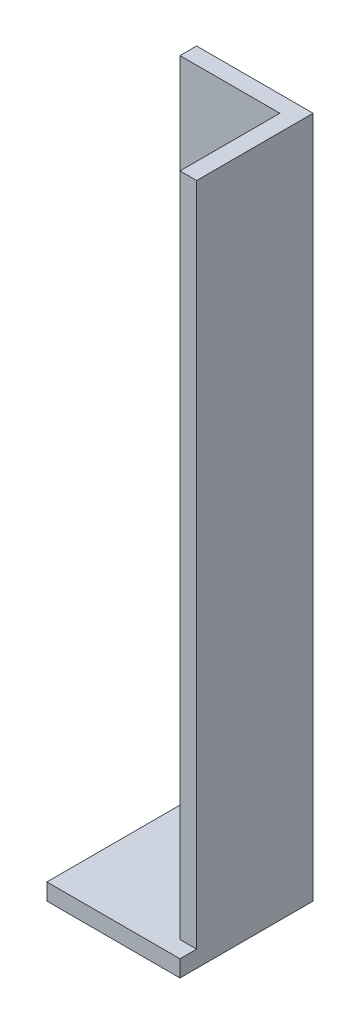
ISO-10303-21;
HEADER;
FILE_DESCRIPTION(('STEP AP214'),'2;1');
FILE_NAME('part.step','',(''),(''),'','','');
FILE_SCHEMA(('AUTOMOTIVE_DESIGN { 1 0 10303 214 1 1 1 1 }'));
ENDSEC;
DATA;
#1=APPLICATION_CONTEXT('core data for automotive mechanical design processes');
#2=APPLICATION_PROTOCOL_DEFINITION('international standard','automotive_design',2000,#1);
#3=PRODUCT_CONTEXT('',#1,'mechanical');
#4=PRODUCT('Part','Part','',(#3));
#5=PRODUCT_RELATED_PRODUCT_CATEGORY('part','',(#4));
#6=PRODUCT_DEFINITION_FORMATION('','',#4);
#7=PRODUCT_DEFINITION_CONTEXT('part definition',#1,'design');
#8=PRODUCT_DEFINITION('design','',#6,#7);
#9=PRODUCT_DEFINITION_SHAPE('','',#8);
#10=(LENGTH_UNIT() NAMED_UNIT(*) SI_UNIT(.MILLI.,.METRE.));
#11=(NAMED_UNIT(*) PLANE_ANGLE_UNIT() SI_UNIT($,.RADIAN.));
#12=(NAMED_UNIT(*) SI_UNIT($,.STERADIAN.) SOLID_ANGLE_UNIT());
#13=UNCERTAINTY_MEASURE_WITH_UNIT(LENGTH_MEASURE(1.E-05),#10,'distance_accuracy_value','');
#14=(GEOMETRIC_REPRESENTATION_CONTEXT(3) GLOBAL_UNCERTAINTY_ASSIGNED_CONTEXT((#13)) GLOBAL_UNIT_ASSIGNED_CONTEXT((#10,
#11,#12)) REPRESENTATION_CONTEXT('',''));
#15=CARTESIAN_POINT('',(0.,0.,0.));
#16=DIRECTION('',(0.,0.,1.));
#17=DIRECTION('',(1.,0.,0.));
#18=AXIS2_PLACEMENT_3D('',#15,#16,#17);
#19=CARTESIAN_POINT('',(0.,10.,0.));
#20=DIRECTION('',(0.,1.,0.));
#21=DIRECTION('',(0.,0.,1.));
#22=AXIS2_PLACEMENT_3D('',#19,#20,#21);
#23=PLANE('',#22);
#24=DIRECTION('',(1.,0.,0.));
#25=VECTOR('',#24,1.);
#26=CARTESIAN_POINT('',(-28.6764577319225,10.,46.9877127909633));
#27=LINE('',#26,#25);
#28=CARTESIAN_POINT('',(-28.6764577319225,10.,46.9877127909633));
#29=VERTEX_POINT('',#28);
#30=CARTESIAN_POINT('',(51.3235422680775,10.,46.9877127909633));
#31=VERTEX_POINT('',#30);
#32=EDGE_CURVE('E199',#29,#31,#27,.T.);
#33=ORIENTED_EDGE('',*,*,#32,.T.);
#34=DIRECTION('',(0.,0.,-1.));
#35=VECTOR('',#34,1.);
#36=CARTESIAN_POINT('',(51.3235422680775,10.,46.9877127909633));
#37=LINE('',#36,#35);
#38=CARTESIAN_POINT('',(51.3235422680775,10.,36.9877127909632));
#39=VERTEX_POINT('',#38);
#40=EDGE_CURVE('E183',#31,#39,#37,.T.);
#41=ORIENTED_EDGE('',*,*,#40,.T.);
#42=DIRECTION('',(1.,0.,0.));
#43=VECTOR('',#42,1.);
#44=CARTESIAN_POINT('',(41.3235422680775,10.,36.9877127909632));
#45=LINE('',#44,#43);
#46=CARTESIAN_POINT('',(41.3235422680775,10.,36.9877127909632));
#47=VERTEX_POINT('',#46);
#48=EDGE_CURVE('E118',#47,#39,#45,.T.);
#49=ORIENTED_EDGE('',*,*,#48,.F.);
#50=DIRECTION('',(0.,0.,1.));
#51=VECTOR('',#50,1.);
#52=CARTESIAN_POINT('',(41.3235422680775,10.,36.9877127909632));
#53=LINE('',#52,#51);
#54=CARTESIAN_POINT('',(41.3235422680775,10.,-23.0122872090368));
#55=VERTEX_POINT('',#54);
#56=EDGE_CURVE('E140',#55,#47,#53,.T.);
#57=ORIENTED_EDGE('',*,*,#56,.F.);
#58=DIRECTION('',(1.,0.,0.));
#59=VECTOR('',#58,1.);
#60=CARTESIAN_POINT('',(41.3235422680775,10.,-23.0122872090368));
#61=LINE('',#60,#59);
#62=CARTESIAN_POINT('',(-18.6764577319225,10.,-23.0122872090368));
#63=VERTEX_POINT('',#62);
#64=EDGE_CURVE('E136',#63,#55,#61,.T.);
#65=ORIENTED_EDGE('',*,*,#64,.F.);
#66=DIRECTION('',(0.,0.,1.));
#67=VECTOR('',#66,1.);
#68=CARTESIAN_POINT('',(-18.6764577319225,10.,-23.0122872090368));
#69=LINE('',#68,#67);
#70=CARTESIAN_POINT('',(-18.6764577319225,10.,-33.0122872090368));
#71=VERTEX_POINT('',#70);
#72=EDGE_CURVE('E132',#71,#63,#69,.T.);
#73=ORIENTED_EDGE('',*,*,#72,.F.);
#74=DIRECTION('',(-1.,0.,0.));
#75=VECTOR('',#74,1.);
#76=CARTESIAN_POINT('',(51.3235422680774,10.,-33.0122872090368));
#77=LINE('',#76,#75);
#78=CARTESIAN_POINT('',(-28.6764577319225,10.,-33.0122872090368));
#79=VERTEX_POINT('',#78);
#80=EDGE_CURVE('E83',#71,#79,#77,.T.);
#81=ORIENTED_EDGE('',*,*,#80,.T.);
#82=DIRECTION('',(0.,0.,1.));
#83=VECTOR('',#82,1.);
#84=CARTESIAN_POINT('',(-28.6764577319225,10.,-33.0122872090368));
#85=LINE('',#84,#83);
#86=EDGE_CURVE('E197',#79,#29,#85,.T.);
#87=ORIENTED_EDGE('',*,*,#86,.T.);
#88=EDGE_LOOP('',(#33,#41,#49,#57,#65,#73,#81,#87));
#89=FACE_BOUND('',#88,.T.);
#90=ADVANCED_FACE('F40',(#89),#23,.T.);
#91=CARTESIAN_POINT('',(-18.6764577319225,410.,-23.0122872090368));
#92=DIRECTION('',(1.,0.,0.));
#93=DIRECTION('',(0.,0.,-1.));
#94=AXIS2_PLACEMENT_3D('',#91,#92,#93);
#95=PLANE('',#94);
#96=ORIENTED_EDGE('',*,*,#72,.T.);
#97=DIRECTION('',(0.,-1.,0.));
#98=VECTOR('',#97,1.);
#99=CARTESIAN_POINT('',(-18.6764577319225,410.,-23.0122872090368));
#100=LINE('',#99,#98);
#101=CARTESIAN_POINT('',(-18.6764577319225,410.,-23.0122872090368));
#102=VERTEX_POINT('',#101);
#103=EDGE_CURVE('E156',#102,#63,#100,.T.);
#104=ORIENTED_EDGE('',*,*,#103,.F.);
#105=DIRECTION('',(0.,0.,1.));
#106=VECTOR('',#105,1.);
#107=CARTESIAN_POINT('',(-18.6764577319225,410.,-23.0122872090368));
#108=LINE('',#107,#106);
#109=CARTESIAN_POINT('',(-18.6764577319225,410.,-33.0122872090368));
#110=VERTEX_POINT('',#109);
#111=EDGE_CURVE('E145',#110,#102,#108,.T.);
#112=ORIENTED_EDGE('',*,*,#111,.F.);
#113=DIRECTION('',(0.,-1.,0.));
#114=VECTOR('',#113,1.);
#115=CARTESIAN_POINT('',(-18.6764577319225,410.,-33.0122872090368));
#116=LINE('',#115,#114);
#117=EDGE_CURVE('E128',#110,#71,#116,.T.);
#118=ORIENTED_EDGE('',*,*,#117,.T.);
#119=EDGE_LOOP('',(#96,#104,#112,#118));
#120=FACE_BOUND('',#119,.T.);
#121=ADVANCED_FACE('F231',(#120),#95,.F.);
#122=CARTESIAN_POINT('',(41.3235422680775,410.,-23.0122872090368));
#123=DIRECTION('',(0.,0.,-1.));
#124=DIRECTION('',(-1.,0.,0.));
#125=AXIS2_PLACEMENT_3D('',#122,#123,#124);
#126=PLANE('',#125);
#127=ORIENTED_EDGE('',*,*,#64,.T.);
#128=DIRECTION('',(0.,-1.,0.));
#129=VECTOR('',#128,1.);
#130=CARTESIAN_POINT('',(41.3235422680775,410.,-23.0122872090368));
#131=LINE('',#130,#129);
#132=CARTESIAN_POINT('',(41.3235422680775,410.,-23.0122872090368));
#133=VERTEX_POINT('',#132);
#134=EDGE_CURVE('E152',#133,#55,#131,.T.);
#135=ORIENTED_EDGE('',*,*,#134,.F.);
#136=DIRECTION('',(1.,0.,0.));
#137=VECTOR('',#136,1.);
#138=CARTESIAN_POINT('',(41.3235422680775,410.,-23.0122872090368));
#139=LINE('',#138,#137);
#140=EDGE_CURVE('E91',#102,#133,#139,.T.);
#141=ORIENTED_EDGE('',*,*,#140,.F.);
#142=ORIENTED_EDGE('',*,*,#103,.T.);
#143=EDGE_LOOP('',(#127,#135,#141,#142));
#144=FACE_BOUND('',#143,.T.);
#145=ADVANCED_FACE('F212',(#144),#126,.F.);
#146=CARTESIAN_POINT('',(41.3235422680775,410.,36.9877127909632));
#147=DIRECTION('',(1.,0.,0.));
#148=DIRECTION('',(0.,0.,-1.));
#149=AXIS2_PLACEMENT_3D('',#146,#147,#148);
#150=PLANE('',#149);
#151=ORIENTED_EDGE('',*,*,#56,.T.);
#152=DIRECTION('',(0.,-1.,0.));
#153=VECTOR('',#152,1.);
#154=CARTESIAN_POINT('',(41.3235422680775,410.,36.9877127909632));
#155=LINE('',#154,#153);
#156=CARTESIAN_POINT('',(41.3235422680775,410.,36.9877127909632));
#157=VERTEX_POINT('',#156);
#158=EDGE_CURVE('E122',#157,#47,#155,.T.);
#159=ORIENTED_EDGE('',*,*,#158,.F.);
#160=DIRECTION('',(0.,0.,1.));
#161=VECTOR('',#160,1.);
#162=CARTESIAN_POINT('',(41.3235422680775,410.,36.9877127909632));
#163=LINE('',#162,#161);
#164=EDGE_CURVE('E106',#133,#157,#163,.T.);
#165=ORIENTED_EDGE('',*,*,#164,.F.);
#166=ORIENTED_EDGE('',*,*,#134,.T.);
#167=EDGE_LOOP('',(#151,#159,#165,#166));
#168=FACE_BOUND('',#167,.T.);
#169=ADVANCED_FACE('F216',(#168),#150,.F.);
#170=CARTESIAN_POINT('',(41.3235422680775,410.,36.9877127909632));
#171=DIRECTION('',(0.,0.,-1.));
#172=DIRECTION('',(-1.,0.,0.));
#173=AXIS2_PLACEMENT_3D('',#170,#171,#172);
#174=PLANE('',#173);
#175=ORIENTED_EDGE('',*,*,#48,.T.);
#176=DIRECTION('',(0.,-1.,0.));
#177=VECTOR('',#176,1.);
#178=CARTESIAN_POINT('',(51.3235422680775,410.,36.9877127909632));
#179=LINE('',#178,#177);
#180=CARTESIAN_POINT('',(51.3235422680775,410.,36.9877127909632));
#181=VERTEX_POINT('',#180);
#182=EDGE_CURVE('E114',#181,#39,#179,.T.);
#183=ORIENTED_EDGE('',*,*,#182,.F.);
#184=DIRECTION('',(1.,0.,0.));
#185=VECTOR('',#184,1.);
#186=CARTESIAN_POINT('',(41.3235422680775,410.,36.9877127909632));
#187=LINE('',#186,#185);
#188=EDGE_CURVE('E100',#157,#181,#187,.T.);
#189=ORIENTED_EDGE('',*,*,#188,.F.);
#190=ORIENTED_EDGE('',*,*,#158,.T.);
#191=EDGE_LOOP('',(#175,#183,#189,#190));
#192=FACE_BOUND('',#191,.T.);
#193=ADVANCED_FACE('F115',(#192),#174,.F.);
#194=CARTESIAN_POINT('',(51.3235422680775,410.,36.9877127909632));
#195=DIRECTION('',(-1.,0.,0.));
#196=DIRECTION('',(0.,0.,1.));
#197=AXIS2_PLACEMENT_3D('',#194,#195,#196);
#198=PLANE('',#197);
#199=ORIENTED_EDGE('',*,*,#182,.T.);
#200=ORIENTED_EDGE('',*,*,#40,.F.);
#201=DIRECTION('',(0.,1.,0.));
#202=VECTOR('',#201,1.);
#203=CARTESIAN_POINT('',(51.3235422680775,-390.,46.9877127909633));
#204=LINE('',#203,#202);
#205=CARTESIAN_POINT('',(51.3235422680775,0.,46.9877127909633));
#206=VERTEX_POINT('',#205);
#207=EDGE_CURVE('E137',#206,#31,#204,.T.);
#208=ORIENTED_EDGE('',*,*,#207,.F.);
#209=DIRECTION('',(0.,0.,-1.));
#210=VECTOR('',#209,1.);
#211=CARTESIAN_POINT('',(51.3235422680775,0.,0.));
#212=LINE('',#211,#210);
#213=CARTESIAN_POINT('',(51.3235422680774,0.,-33.0122872090368));
#214=VERTEX_POINT('',#213);
#215=EDGE_CURVE('E12',#206,#214,#212,.T.);
#216=ORIENTED_EDGE('',*,*,#215,.T.);
#217=DIRECTION('',(0.,-1.,0.));
#218=VECTOR('',#217,1.);
#219=CARTESIAN_POINT('',(51.3235422680774,410.,-33.0122872090368));
#220=LINE('',#219,#218);
#221=CARTESIAN_POINT('',(51.3235422680774,410.,-33.0122872090368));
#222=VERTEX_POINT('',#221);
#223=EDGE_CURVE('E56',#222,#214,#220,.T.);
#224=ORIENTED_EDGE('',*,*,#223,.F.);
#225=DIRECTION('',(0.,0.,-1.));
#226=VECTOR('',#225,1.);
#227=CARTESIAN_POINT('',(51.3235422680775,410.,36.9877127909632));
#228=LINE('',#227,#226);
#229=EDGE_CURVE('E104',#181,#222,#228,.T.);
#230=ORIENTED_EDGE('',*,*,#229,.F.);
#231=EDGE_LOOP('',(#199,#200,#208,#216,#224,#230));
#232=FACE_BOUND('',#231,.T.);
#233=ADVANCED_FACE('F124',(#232),#198,.F.);
#234=CARTESIAN_POINT('',(51.3235422680774,410.,-33.0122872090368));
#235=DIRECTION('',(0.,0.,1.));
#236=DIRECTION('',(1.,0.,0.));
#237=AXIS2_PLACEMENT_3D('',#234,#235,#236);
#238=PLANE('',#237);
#239=ORIENTED_EDGE('',*,*,#223,.T.);
#240=DIRECTION('',(-1.,0.,0.));
#241=VECTOR('',#240,1.);
#242=CARTESIAN_POINT('',(0.,0.,-33.0122872090368));
#243=LINE('',#242,#241);
#244=CARTESIAN_POINT('',(-28.6764577319225,0.,-33.0122872090368));
#245=VERTEX_POINT('',#244);
#246=EDGE_CURVE('E159',#214,#245,#243,.T.);
#247=ORIENTED_EDGE('',*,*,#246,.T.);
#248=DIRECTION('',(0.,1.,0.));
#249=VECTOR('',#248,1.);
#250=CARTESIAN_POINT('',(-28.6764577319225,-390.,-33.0122872090368));
#251=LINE('',#250,#249);
#252=EDGE_CURVE('E191',#245,#79,#251,.T.);
#253=ORIENTED_EDGE('',*,*,#252,.T.);
#254=ORIENTED_EDGE('',*,*,#80,.F.);
#255=ORIENTED_EDGE('',*,*,#117,.F.);
#256=DIRECTION('',(-1.,0.,0.));
#257=VECTOR('',#256,1.);
#258=CARTESIAN_POINT('',(51.3235422680774,410.,-33.0122872090368));
#259=LINE('',#258,#257);
#260=EDGE_CURVE('E63',#222,#110,#259,.T.);
#261=ORIENTED_EDGE('',*,*,#260,.F.);
#262=EDGE_LOOP('',(#239,#247,#253,#254,#255,#261));
#263=FACE_BOUND('',#262,.T.);
#264=ADVANCED_FACE('F189',(#263),#238,.F.);
#265=CARTESIAN_POINT('',(0.,410.,0.));
#266=DIRECTION('',(0.,1.,0.));
#267=DIRECTION('',(0.,0.,1.));
#268=AXIS2_PLACEMENT_3D('',#265,#266,#267);
#269=PLANE('',#268);
#270=ORIENTED_EDGE('',*,*,#111,.T.);
#271=ORIENTED_EDGE('',*,*,#140,.T.);
#272=ORIENTED_EDGE('',*,*,#164,.T.);
#273=ORIENTED_EDGE('',*,*,#188,.T.);
#274=ORIENTED_EDGE('',*,*,#229,.T.);
#275=ORIENTED_EDGE('',*,*,#260,.T.);
#276=EDGE_LOOP('',(#270,#271,#272,#273,#274,#275));
#277=FACE_BOUND('',#276,.T.);
#278=ADVANCED_FACE('F102',(#277),#269,.T.);
#279=CARTESIAN_POINT('',(-28.6764577319225,-390.,46.9877127909633));
#280=DIRECTION('',(0.,0.,1.));
#281=DIRECTION('',(1.,0.,0.));
#282=AXIS2_PLACEMENT_3D('',#279,#280,#281);
#283=PLANE('',#282);
#284=DIRECTION('',(1.,0.,0.));
#285=VECTOR('',#284,1.);
#286=CARTESIAN_POINT('',(0.,0.,46.9877127909633));
#287=LINE('',#286,#285);
#288=CARTESIAN_POINT('',(-28.6764577319225,0.,46.9877127909633));
#289=VERTEX_POINT('',#288);
#290=EDGE_CURVE('E49',#289,#206,#287,.T.);
#291=ORIENTED_EDGE('',*,*,#290,.T.);
#292=ORIENTED_EDGE('',*,*,#207,.T.);
#293=ORIENTED_EDGE('',*,*,#32,.F.);
#294=DIRECTION('',(0.,1.,0.));
#295=VECTOR('',#294,1.);
#296=CARTESIAN_POINT('',(-28.6764577319225,-390.,46.9877127909633));
#297=LINE('',#296,#295);
#298=EDGE_CURVE('E177',#289,#29,#297,.T.);
#299=ORIENTED_EDGE('',*,*,#298,.F.);
#300=EDGE_LOOP('',(#291,#292,#293,#299));
#301=FACE_BOUND('',#300,.T.);
#302=ADVANCED_FACE('F172',(#301),#283,.T.);
#303=CARTESIAN_POINT('',(-28.6764577319225,-390.,-33.0122872090368));
#304=DIRECTION('',(-1.,0.,0.));
#305=DIRECTION('',(0.,0.,1.));
#306=AXIS2_PLACEMENT_3D('',#303,#304,#305);
#307=PLANE('',#306);
#308=DIRECTION('',(0.,0.,1.));
#309=VECTOR('',#308,1.);
#310=CARTESIAN_POINT('',(-28.6764577319225,0.,0.));
#311=LINE('',#310,#309);
#312=EDGE_CURVE('E162',#245,#289,#311,.T.);
#313=ORIENTED_EDGE('',*,*,#312,.T.);
#314=ORIENTED_EDGE('',*,*,#298,.T.);
#315=ORIENTED_EDGE('',*,*,#86,.F.);
#316=ORIENTED_EDGE('',*,*,#252,.F.);
#317=EDGE_LOOP('',(#313,#314,#315,#316));
#318=FACE_BOUND('',#317,.T.);
#319=ADVANCED_FACE('F195',(#318),#307,.T.);
#320=CARTESIAN_POINT('',(0.,0.,0.));
#321=DIRECTION('',(0.,1.,0.));
#322=DIRECTION('',(0.,0.,1.));
#323=AXIS2_PLACEMENT_3D('',#320,#321,#322);
#324=PLANE('',#323);
#325=ORIENTED_EDGE('',*,*,#215,.F.);
#326=ORIENTED_EDGE('',*,*,#290,.F.);
#327=ORIENTED_EDGE('',*,*,#312,.F.);
#328=ORIENTED_EDGE('',*,*,#246,.F.);
#329=EDGE_LOOP('',(#325,#326,#327,#328));
#330=FACE_BOUND('',#329,.T.);
#331=ADVANCED_FACE('F42',(#330),#324,.F.);
#332=CLOSED_SHELL('',(#90,#121,#145,#169,#193,#233,#264,#278,#302,#319,#331));
#333=MANIFOLD_SOLID_BREP('B2',#332);
#334=ADVANCED_BREP_SHAPE_REPRESENTATION('',(#18,#333),#14);
#335=SHAPE_DEFINITION_REPRESENTATION(#9,#334);
ENDSEC;
END-ISO-10303-21;
